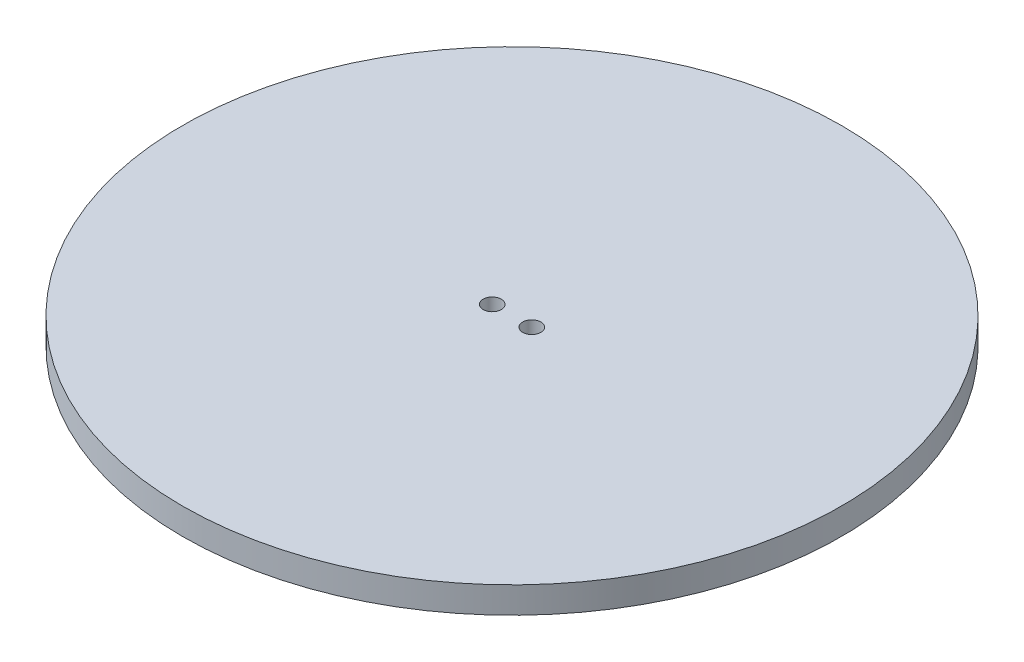
ISO-10303-21;
HEADER;
FILE_DESCRIPTION(('STEP AP214'),'2;1');
FILE_NAME('part.step','',(''),(''),'','','');
FILE_SCHEMA(('AUTOMOTIVE_DESIGN { 1 0 10303 214 1 1 1 1 }'));
ENDSEC;
DATA;
#1=APPLICATION_CONTEXT('core data for automotive mechanical design processes');
#2=APPLICATION_PROTOCOL_DEFINITION('international standard','automotive_design',2000,#1);
#3=PRODUCT_CONTEXT('',#1,'mechanical');
#4=PRODUCT('Part','Part','',(#3));
#5=PRODUCT_RELATED_PRODUCT_CATEGORY('part','',(#4));
#6=PRODUCT_DEFINITION_FORMATION('','',#4);
#7=PRODUCT_DEFINITION_CONTEXT('part definition',#1,'design');
#8=PRODUCT_DEFINITION('design','',#6,#7);
#9=PRODUCT_DEFINITION_SHAPE('','',#8);
#10=(LENGTH_UNIT() NAMED_UNIT(*) SI_UNIT(.MILLI.,.METRE.));
#11=(NAMED_UNIT(*) PLANE_ANGLE_UNIT() SI_UNIT($,.RADIAN.));
#12=(NAMED_UNIT(*) SI_UNIT($,.STERADIAN.) SOLID_ANGLE_UNIT());
#13=UNCERTAINTY_MEASURE_WITH_UNIT(LENGTH_MEASURE(1.E-05),#10,'distance_accuracy_value','');
#14=(GEOMETRIC_REPRESENTATION_CONTEXT(3) GLOBAL_UNCERTAINTY_ASSIGNED_CONTEXT((#13)) GLOBAL_UNIT_ASSIGNED_CONTEXT((#10,
#11,#12)) REPRESENTATION_CONTEXT('',''));
#15=CARTESIAN_POINT('',(0.,0.,0.));
#16=DIRECTION('',(0.,0.,1.));
#17=DIRECTION('',(1.,0.,0.));
#18=AXIS2_PLACEMENT_3D('',#15,#16,#17);
#19=CARTESIAN_POINT('',(0.,8.,0.));
#20=DIRECTION('',(0.,-1.,0.));
#21=DIRECTION('',(0.,0.,-1.));
#22=AXIS2_PLACEMENT_3D('',#19,#20,#21);
#23=CYLINDRICAL_SURFACE('',#22,100.);
#24=CARTESIAN_POINT('',(0.,8.,0.));
#25=DIRECTION('',(0.,1.,0.));
#26=DIRECTION('',(0.,0.,1.));
#27=AXIS2_PLACEMENT_3D('',#24,#25,#26);
#28=CIRCLE('',#27,100.);
#29=CARTESIAN_POINT('',(0.,8.,100.));
#30=VERTEX_POINT('',#29);
#31=EDGE_CURVE('E10',#30,#30,#28,.T.);
#32=ORIENTED_EDGE('',*,*,#31,.F.);
#33=EDGE_LOOP('',(#32));
#34=FACE_BOUND('',#33,.T.);
#35=CARTESIAN_POINT('',(0.,0.,0.));
#36=DIRECTION('',(0.,1.,0.));
#37=DIRECTION('',(0.,0.,1.));
#38=AXIS2_PLACEMENT_3D('',#35,#36,#37);
#39=CIRCLE('',#38,100.);
#40=CARTESIAN_POINT('',(0.,0.,100.));
#41=VERTEX_POINT('',#40);
#42=EDGE_CURVE('E34',#41,#41,#39,.T.);
#43=ORIENTED_EDGE('',*,*,#42,.T.);
#44=EDGE_LOOP('',(#43));
#45=FACE_BOUND('',#44,.T.);
#46=ADVANCED_FACE('F31',(#34,#45),#23,.T.);
#47=CARTESIAN_POINT('',(0.,8.,0.));
#48=DIRECTION('',(0.,1.,0.));
#49=DIRECTION('',(0.,0.,1.));
#50=AXIS2_PLACEMENT_3D('',#47,#48,#49);
#51=PLANE('',#50);
#52=CARTESIAN_POINT('',(-6.,8.,0.));
#53=DIRECTION('',(0.,1.,0.));
#54=DIRECTION('',(0.,0.,1.));
#55=AXIS2_PLACEMENT_3D('',#52,#53,#54);
#56=CIRCLE('',#55,2.75);
#57=CARTESIAN_POINT('',(-6.,8.,2.75));
#58=VERTEX_POINT('',#57);
#59=EDGE_CURVE('E49',#58,#58,#56,.T.);
#60=ORIENTED_EDGE('',*,*,#59,.F.);
#61=EDGE_LOOP('',(#60));
#62=FACE_BOUND('',#61,.T.);
#63=CARTESIAN_POINT('',(6.,8.,0.));
#64=DIRECTION('',(0.,1.,0.));
#65=DIRECTION('',(0.,0.,1.));
#66=AXIS2_PLACEMENT_3D('',#63,#64,#65);
#67=CIRCLE('',#66,2.75);
#68=CARTESIAN_POINT('',(6.,8.,2.75));
#69=VERTEX_POINT('',#68);
#70=EDGE_CURVE('E43',#69,#69,#67,.T.);
#71=ORIENTED_EDGE('',*,*,#70,.F.);
#72=EDGE_LOOP('',(#71));
#73=FACE_BOUND('',#72,.T.);
#74=ORIENTED_EDGE('',*,*,#31,.T.);
#75=EDGE_LOOP('',(#74));
#76=FACE_BOUND('',#75,.T.);
#77=ADVANCED_FACE('F65',(#62,#73,#76),#51,.T.);
#78=CARTESIAN_POINT('',(0.,0.,0.));
#79=DIRECTION('',(0.,1.,0.));
#80=DIRECTION('',(0.,0.,1.));
#81=AXIS2_PLACEMENT_3D('',#78,#79,#80);
#82=PLANE('',#81);
#83=CARTESIAN_POINT('',(-6.,0.,0.));
#84=DIRECTION('',(0.,1.,0.));
#85=DIRECTION('',(0.,0.,1.));
#86=AXIS2_PLACEMENT_3D('',#83,#84,#85);
#87=CIRCLE('',#86,2.75);
#88=CARTESIAN_POINT('',(-6.,0.,2.75));
#89=VERTEX_POINT('',#88);
#90=EDGE_CURVE('E46',#89,#89,#87,.T.);
#91=ORIENTED_EDGE('',*,*,#90,.T.);
#92=EDGE_LOOP('',(#91));
#93=FACE_BOUND('',#92,.T.);
#94=CARTESIAN_POINT('',(6.,0.,0.));
#95=DIRECTION('',(0.,1.,0.));
#96=DIRECTION('',(0.,0.,1.));
#97=AXIS2_PLACEMENT_3D('',#94,#95,#96);
#98=CIRCLE('',#97,2.75);
#99=CARTESIAN_POINT('',(6.,0.,2.75));
#100=VERTEX_POINT('',#99);
#101=EDGE_CURVE('E41',#100,#100,#98,.T.);
#102=ORIENTED_EDGE('',*,*,#101,.T.);
#103=EDGE_LOOP('',(#102));
#104=FACE_BOUND('',#103,.T.);
#105=ORIENTED_EDGE('',*,*,#42,.F.);
#106=EDGE_LOOP('',(#105));
#107=FACE_BOUND('',#106,.T.);
#108=ADVANCED_FACE('F55',(#93,#104,#107),#82,.F.);
#109=CARTESIAN_POINT('',(6.,0.,0.));
#110=DIRECTION('',(0.,1.,0.));
#111=DIRECTION('',(0.,0.,1.));
#112=AXIS2_PLACEMENT_3D('',#109,#110,#111);
#113=CYLINDRICAL_SURFACE('',#112,2.75);
#114=ORIENTED_EDGE('',*,*,#101,.F.);
#115=EDGE_LOOP('',(#114));
#116=FACE_BOUND('',#115,.T.);
#117=ORIENTED_EDGE('',*,*,#70,.T.);
#118=EDGE_LOOP('',(#117));
#119=FACE_BOUND('',#118,.T.);
#120=ADVANCED_FACE('F61',(#116,#119),#113,.F.);
#121=CARTESIAN_POINT('',(-6.,0.,0.));
#122=DIRECTION('',(0.,1.,0.));
#123=DIRECTION('',(0.,0.,1.));
#124=AXIS2_PLACEMENT_3D('',#121,#122,#123);
#125=CYLINDRICAL_SURFACE('',#124,2.75);
#126=ORIENTED_EDGE('',*,*,#90,.F.);
#127=EDGE_LOOP('',(#126));
#128=FACE_BOUND('',#127,.T.);
#129=ORIENTED_EDGE('',*,*,#59,.T.);
#130=EDGE_LOOP('',(#129));
#131=FACE_BOUND('',#130,.T.);
#132=ADVANCED_FACE('F58',(#128,#131),#125,.F.);
#133=CLOSED_SHELL('',(#46,#77,#108,#120,#132));
#134=MANIFOLD_SOLID_BREP('B2',#133);
#135=ADVANCED_BREP_SHAPE_REPRESENTATION('',(#18,#134),#14);
#136=SHAPE_DEFINITION_REPRESENTATION(#9,#135);
ENDSEC;
END-ISO-10303-21;
